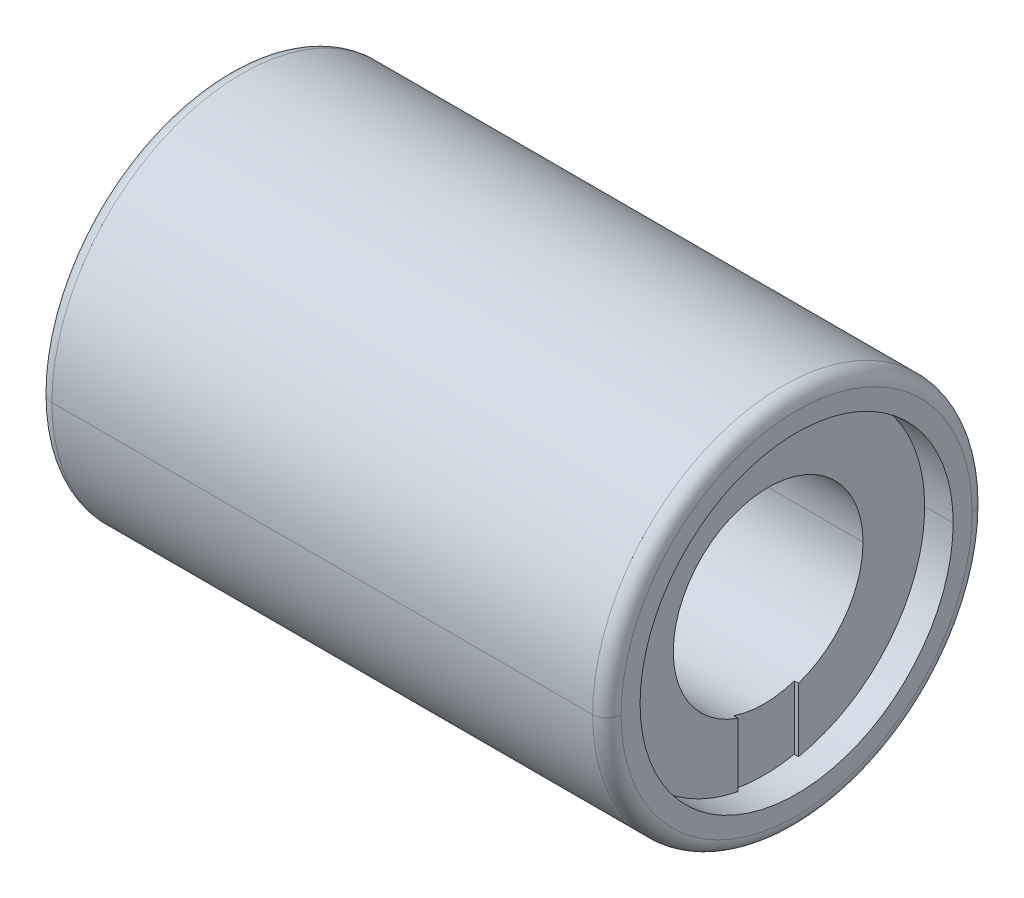
ISO-10303-21;
HEADER;
FILE_DESCRIPTION(('STEP AP214'),'2;1');
FILE_NAME('part.step','',(''),(''),'','','');
FILE_SCHEMA(('AUTOMOTIVE_DESIGN { 1 0 10303 214 1 1 1 1 }'));
ENDSEC;
DATA;
#1=APPLICATION_CONTEXT('core data for automotive mechanical design processes');
#2=APPLICATION_PROTOCOL_DEFINITION('international standard','automotive_design',2000,#1);
#3=PRODUCT_CONTEXT('',#1,'mechanical');
#4=PRODUCT('Part','Part','',(#3));
#5=PRODUCT_RELATED_PRODUCT_CATEGORY('part','',(#4));
#6=PRODUCT_DEFINITION_FORMATION('','',#4);
#7=PRODUCT_DEFINITION_CONTEXT('part definition',#1,'design');
#8=PRODUCT_DEFINITION('design','',#6,#7);
#9=PRODUCT_DEFINITION_SHAPE('','',#8);
#10=(LENGTH_UNIT() NAMED_UNIT(*) SI_UNIT(.MILLI.,.METRE.));
#11=(NAMED_UNIT(*) PLANE_ANGLE_UNIT() SI_UNIT($,.RADIAN.));
#12=(NAMED_UNIT(*) SI_UNIT($,.STERADIAN.) SOLID_ANGLE_UNIT());
#13=UNCERTAINTY_MEASURE_WITH_UNIT(LENGTH_MEASURE(1.E-05),#10,'distance_accuracy_value','');
#14=(GEOMETRIC_REPRESENTATION_CONTEXT(3) GLOBAL_UNCERTAINTY_ASSIGNED_CONTEXT((#13)) GLOBAL_UNIT_ASSIGNED_CONTEXT((#10,
#11,#12)) REPRESENTATION_CONTEXT('',''));
#15=CARTESIAN_POINT('',(0.,0.,0.));
#16=DIRECTION('',(0.,0.,1.));
#17=DIRECTION('',(1.,0.,0.));
#18=AXIS2_PLACEMENT_3D('',#15,#16,#17);
#19=CARTESIAN_POINT('',(12.,0.,0.));
#20=DIRECTION('',(-1.,0.,0.));
#21=DIRECTION('',(0.,-1.,0.));
#22=AXIS2_PLACEMENT_3D('',#19,#20,#21);
#23=CYLINDRICAL_SURFACE('',#22,3.3);
#24=CARTESIAN_POINT('',(0.6,0.,0.));
#25=DIRECTION('',(1.,0.,0.));
#26=DIRECTION('',(0.,0.,-1.));
#27=AXIS2_PLACEMENT_3D('',#24,#25,#26);
#28=CIRCLE('',#27,3.3);
#29=CARTESIAN_POINT('',(0.6,0.,-3.3));
#30=VERTEX_POINT('',#29);
#31=CARTESIAN_POINT('',(0.6,0.,3.3));
#32=VERTEX_POINT('',#31);
#33=EDGE_CURVE('E11',#30,#32,#28,.T.);
#34=ORIENTED_EDGE('',*,*,#33,.T.);
#35=DIRECTION('',(-1.,0.,0.));
#36=VECTOR('',#35,1.);
#37=CARTESIAN_POINT('',(0.6,0.,3.3));
#38=LINE('',#37,#36);
#39=CARTESIAN_POINT('',(0.,0.,3.3));
#40=VERTEX_POINT('',#39);
#41=EDGE_CURVE('E26',#32,#40,#38,.T.);
#42=ORIENTED_EDGE('',*,*,#41,.T.);
#43=CARTESIAN_POINT('',(0.,0.,0.));
#44=DIRECTION('',(1.,0.,0.));
#45=DIRECTION('',(0.,0.,-1.));
#46=AXIS2_PLACEMENT_3D('',#43,#44,#45);
#47=CIRCLE('',#46,3.3);
#48=CARTESIAN_POINT('',(0.,0.,-3.3));
#49=VERTEX_POINT('',#48);
#50=EDGE_CURVE('E531',#49,#40,#47,.T.);
#51=ORIENTED_EDGE('',*,*,#50,.F.);
#52=DIRECTION('',(-1.,0.,0.));
#53=VECTOR('',#52,1.);
#54=CARTESIAN_POINT('',(0.6,0.,-3.3));
#55=LINE('',#54,#53);
#56=EDGE_CURVE('E528',#30,#49,#55,.T.);
#57=ORIENTED_EDGE('',*,*,#56,.F.);
#58=EDGE_LOOP('',(#34,#42,#51,#57));
#59=FACE_BOUND('',#58,.T.);
#60=ADVANCED_FACE('F18',(#59),#23,.F.);
#61=CARTESIAN_POINT('',(12.,0.,0.));
#62=DIRECTION('',(-1.,0.,0.));
#63=DIRECTION('',(0.,1.,0.));
#64=AXIS2_PLACEMENT_3D('',#61,#62,#63);
#65=CYLINDRICAL_SURFACE('',#64,3.3);
#66=CARTESIAN_POINT('',(0.,0.,0.));
#67=DIRECTION('',(1.,0.,0.));
#68=DIRECTION('',(0.,0.,-1.));
#69=AXIS2_PLACEMENT_3D('',#66,#67,#68);
#70=CIRCLE('',#69,3.3);
#71=EDGE_CURVE('E466',#40,#49,#70,.T.);
#72=ORIENTED_EDGE('',*,*,#71,.F.);
#73=ORIENTED_EDGE('',*,*,#41,.F.);
#74=CARTESIAN_POINT('',(0.6,0.,0.));
#75=DIRECTION('',(1.,0.,0.));
#76=DIRECTION('',(0.,0.,-1.));
#77=AXIS2_PLACEMENT_3D('',#74,#75,#76);
#78=CIRCLE('',#77,3.3);
#79=EDGE_CURVE('E460',#32,#30,#78,.T.);
#80=ORIENTED_EDGE('',*,*,#79,.T.);
#81=ORIENTED_EDGE('',*,*,#56,.T.);
#82=EDGE_LOOP('',(#72,#73,#80,#81));
#83=FACE_BOUND('',#82,.T.);
#84=ADVANCED_FACE('F316',(#83),#65,.F.);
#85=CARTESIAN_POINT('',(0.6,3.3,0.));
#86=DIRECTION('',(-1.,0.,0.));
#87=DIRECTION('',(0.,0.,1.));
#88=AXIS2_PLACEMENT_3D('',#85,#86,#87);
#89=PLANE('',#88);
#90=CARTESIAN_POINT('',(0.6,0.,0.));
#91=DIRECTION('',(1.,0.,0.));
#92=DIRECTION('',(0.,0.,-1.));
#93=AXIS2_PLACEMENT_3D('',#90,#91,#92);
#94=CIRCLE('',#93,2.);
#95=CARTESIAN_POINT('',(0.6,0.,-2.));
#96=VERTEX_POINT('',#95);
#97=CARTESIAN_POINT('',(0.6,0.,2.));
#98=VERTEX_POINT('',#97);
#99=EDGE_CURVE('E458',#96,#98,#94,.T.);
#100=ORIENTED_EDGE('',*,*,#99,.T.);
#101=CARTESIAN_POINT('',(0.6,0.,0.));
#102=DIRECTION('',(1.,0.,0.));
#103=DIRECTION('',(0.,0.,-1.));
#104=AXIS2_PLACEMENT_3D('',#101,#102,#103);
#105=CIRCLE('',#104,2.);
#106=EDGE_CURVE('E457',#98,#96,#105,.T.);
#107=ORIENTED_EDGE('',*,*,#106,.T.);
#108=EDGE_LOOP('',(#100,#107));
#109=FACE_BOUND('',#108,.T.);
#110=ORIENTED_EDGE('',*,*,#33,.F.);
#111=ORIENTED_EDGE('',*,*,#79,.F.);
#112=EDGE_LOOP('',(#110,#111));
#113=FACE_BOUND('',#112,.T.);
#114=ADVANCED_FACE('F320',(#109,#113),#89,.T.);
#115=CARTESIAN_POINT('',(12.,0.,0.));
#116=DIRECTION('',(-1.,0.,0.));
#117=DIRECTION('',(0.,1.,0.));
#118=AXIS2_PLACEMENT_3D('',#115,#116,#117);
#119=CYLINDRICAL_SURFACE('',#118,2.);
#120=ORIENTED_EDGE('',*,*,#106,.F.);
#121=DIRECTION('',(-1.,0.,0.));
#122=VECTOR('',#121,1.);
#123=CARTESIAN_POINT('',(11.4,0.,2.));
#124=LINE('',#123,#122);
#125=CARTESIAN_POINT('',(11.4,0.,2.));
#126=VERTEX_POINT('',#125);
#127=EDGE_CURVE('E424',#126,#98,#124,.T.);
#128=ORIENTED_EDGE('',*,*,#127,.F.);
#129=CARTESIAN_POINT('',(11.4,0.,0.));
#130=DIRECTION('',(1.,0.,0.));
#131=DIRECTION('',(0.,0.,-1.));
#132=AXIS2_PLACEMENT_3D('',#129,#130,#131);
#133=CIRCLE('',#132,2.);
#134=CARTESIAN_POINT('',(11.4,-1.89483508517232,0.64));
#135=VERTEX_POINT('',#134);
#136=EDGE_CURVE('E421',#126,#135,#133,.T.);
#137=ORIENTED_EDGE('',*,*,#136,.T.);
#138=DIRECTION('',(1.,0.,0.));
#139=VECTOR('',#138,1.);
#140=CARTESIAN_POINT('',(12.,-1.89483508517232,0.64));
#141=LINE('',#140,#139);
#142=CARTESIAN_POINT('',(11.312,-1.89483508517232,0.64));
#143=VERTEX_POINT('',#142);
#144=EDGE_CURVE('E419',#143,#135,#141,.T.);
#145=ORIENTED_EDGE('',*,*,#144,.F.);
#146=CARTESIAN_POINT('',(11.312,0.,0.));
#147=DIRECTION('',(1.,0.,0.));
#148=DIRECTION('',(0.,0.,-1.));
#149=AXIS2_PLACEMENT_3D('',#146,#147,#148);
#150=CIRCLE('',#149,2.);
#151=CARTESIAN_POINT('',(11.312,-1.89483508517232,-0.64));
#152=VERTEX_POINT('',#151);
#153=EDGE_CURVE('E433',#143,#152,#150,.T.);
#154=ORIENTED_EDGE('',*,*,#153,.T.);
#155=DIRECTION('',(1.,0.,0.));
#156=VECTOR('',#155,1.);
#157=CARTESIAN_POINT('',(12.,-1.89483508517232,-0.64));
#158=LINE('',#157,#156);
#159=CARTESIAN_POINT('',(11.4,-1.89483508517232,-0.64));
#160=VERTEX_POINT('',#159);
#161=EDGE_CURVE('E435',#152,#160,#158,.T.);
#162=ORIENTED_EDGE('',*,*,#161,.T.);
#163=CARTESIAN_POINT('',(11.4,0.,0.));
#164=DIRECTION('',(1.,0.,0.));
#165=DIRECTION('',(0.,0.,-1.));
#166=AXIS2_PLACEMENT_3D('',#163,#164,#165);
#167=CIRCLE('',#166,2.);
#168=CARTESIAN_POINT('',(11.4,0.,-2.));
#169=VERTEX_POINT('',#168);
#170=EDGE_CURVE('E439',#160,#169,#167,.T.);
#171=ORIENTED_EDGE('',*,*,#170,.T.);
#172=DIRECTION('',(-1.,0.,0.));
#173=VECTOR('',#172,1.);
#174=CARTESIAN_POINT('',(11.4,0.,-2.));
#175=LINE('',#174,#173);
#176=EDGE_CURVE('E444',#169,#96,#175,.T.);
#177=ORIENTED_EDGE('',*,*,#176,.T.);
#178=EDGE_LOOP('',(#120,#128,#137,#145,#154,#162,#171,#177));
#179=FACE_BOUND('',#178,.T.);
#180=ADVANCED_FACE('F325',(#179),#119,.F.);
#181=CARTESIAN_POINT('',(12.,0.,0.));
#182=DIRECTION('',(-1.,0.,0.));
#183=DIRECTION('',(0.,-1.,0.));
#184=AXIS2_PLACEMENT_3D('',#181,#182,#183);
#185=CYLINDRICAL_SURFACE('',#184,2.);
#186=CARTESIAN_POINT('',(11.4,0.,0.));
#187=DIRECTION('',(1.,0.,0.));
#188=DIRECTION('',(0.,0.,-1.));
#189=AXIS2_PLACEMENT_3D('',#186,#187,#188);
#190=CIRCLE('',#189,2.);
#191=EDGE_CURVE('E407',#169,#126,#190,.T.);
#192=ORIENTED_EDGE('',*,*,#191,.T.);
#193=ORIENTED_EDGE('',*,*,#127,.T.);
#194=ORIENTED_EDGE('',*,*,#99,.F.);
#195=ORIENTED_EDGE('',*,*,#176,.F.);
#196=EDGE_LOOP('',(#192,#193,#194,#195));
#197=FACE_BOUND('',#196,.T.);
#198=ADVANCED_FACE('F331',(#197),#185,.F.);
#199=CARTESIAN_POINT('',(11.4,2.,0.));
#200=DIRECTION('',(1.,0.,0.));
#201=DIRECTION('',(0.,0.,-1.));
#202=AXIS2_PLACEMENT_3D('',#199,#200,#201);
#203=PLANE('',#202);
#204=DIRECTION('',(0.,-1.,0.));
#205=VECTOR('',#204,1.);
#206=CARTESIAN_POINT('',(11.4,2.,0.64));
#207=LINE('',#206,#205);
#208=CARTESIAN_POINT('',(11.4,-3.2373445908646,0.64));
#209=VERTEX_POINT('',#208);
#210=EDGE_CURVE('E402',#135,#209,#207,.T.);
#211=ORIENTED_EDGE('',*,*,#210,.F.);
#212=ORIENTED_EDGE('',*,*,#136,.F.);
#213=ORIENTED_EDGE('',*,*,#191,.F.);
#214=ORIENTED_EDGE('',*,*,#170,.F.);
#215=DIRECTION('',(0.,1.,0.));
#216=VECTOR('',#215,1.);
#217=CARTESIAN_POINT('',(11.4,2.,-0.64));
#218=LINE('',#217,#216);
#219=CARTESIAN_POINT('',(11.4,-3.2373445908646,-0.639999999999998));
#220=VERTEX_POINT('',#219);
#221=EDGE_CURVE('E398',#220,#160,#218,.T.);
#222=ORIENTED_EDGE('',*,*,#221,.F.);
#223=CARTESIAN_POINT('',(11.4,0.,0.));
#224=DIRECTION('',(1.,0.,0.));
#225=DIRECTION('',(0.,0.,-1.));
#226=AXIS2_PLACEMENT_3D('',#223,#224,#225);
#227=CIRCLE('',#226,3.3);
#228=CARTESIAN_POINT('',(11.4,0.,-3.3));
#229=VERTEX_POINT('',#228);
#230=EDGE_CURVE('E397',#220,#229,#227,.T.);
#231=ORIENTED_EDGE('',*,*,#230,.T.);
#232=CARTESIAN_POINT('',(11.4,0.,0.));
#233=DIRECTION('',(1.,0.,0.));
#234=DIRECTION('',(0.,0.,-1.));
#235=AXIS2_PLACEMENT_3D('',#232,#233,#234);
#236=CIRCLE('',#235,3.3);
#237=CARTESIAN_POINT('',(11.4,0.,3.3));
#238=VERTEX_POINT('',#237);
#239=EDGE_CURVE('E477',#229,#238,#236,.T.);
#240=ORIENTED_EDGE('',*,*,#239,.T.);
#241=CARTESIAN_POINT('',(11.4,0.,0.));
#242=DIRECTION('',(1.,0.,0.));
#243=DIRECTION('',(0.,0.,-1.));
#244=AXIS2_PLACEMENT_3D('',#241,#242,#243);
#245=CIRCLE('',#244,3.3);
#246=EDGE_CURVE('E375',#238,#209,#245,.T.);
#247=ORIENTED_EDGE('',*,*,#246,.T.);
#248=EDGE_LOOP('',(#211,#212,#213,#214,#222,#231,#240,#247));
#249=FACE_BOUND('',#248,.T.);
#250=ADVANCED_FACE('F335',(#249),#203,.T.);
#251=CARTESIAN_POINT('',(12.,0.,0.));
#252=DIRECTION('',(-1.,0.,0.));
#253=DIRECTION('',(0.,1.,0.));
#254=AXIS2_PLACEMENT_3D('',#251,#252,#253);
#255=CYLINDRICAL_SURFACE('',#254,3.3);
#256=ORIENTED_EDGE('',*,*,#246,.F.);
#257=DIRECTION('',(-1.,0.,0.));
#258=VECTOR('',#257,1.);
#259=CARTESIAN_POINT('',(12.,0.,3.3));
#260=LINE('',#259,#258);
#261=CARTESIAN_POINT('',(12.,0.,3.3));
#262=VERTEX_POINT('',#261);
#263=EDGE_CURVE('E368',#262,#238,#260,.T.);
#264=ORIENTED_EDGE('',*,*,#263,.F.);
#265=CARTESIAN_POINT('',(12.,0.,0.));
#266=DIRECTION('',(1.,0.,0.));
#267=DIRECTION('',(0.,0.,-1.));
#268=AXIS2_PLACEMENT_3D('',#265,#266,#267);
#269=CIRCLE('',#268,3.3);
#270=CARTESIAN_POINT('',(12.,0.,-3.3));
#271=VERTEX_POINT('',#270);
#272=EDGE_CURVE('E373',#262,#271,#269,.T.);
#273=ORIENTED_EDGE('',*,*,#272,.T.);
#274=DIRECTION('',(-1.,0.,0.));
#275=VECTOR('',#274,1.);
#276=CARTESIAN_POINT('',(12.,0.,-3.3));
#277=LINE('',#276,#275);
#278=EDGE_CURVE('E370',#271,#229,#277,.T.);
#279=ORIENTED_EDGE('',*,*,#278,.T.);
#280=ORIENTED_EDGE('',*,*,#230,.F.);
#281=DIRECTION('',(1.,0.,0.));
#282=VECTOR('',#281,1.);
#283=CARTESIAN_POINT('',(11.312,-3.2373445908646,-0.639999999999998));
#284=LINE('',#283,#282);
#285=CARTESIAN_POINT('',(11.312,-3.2373445908646,-0.639999999999998));
#286=VERTEX_POINT('',#285);
#287=EDGE_CURVE('E377',#286,#220,#284,.T.);
#288=ORIENTED_EDGE('',*,*,#287,.F.);
#289=CARTESIAN_POINT('',(11.312,0.,0.));
#290=DIRECTION('',(1.,0.,0.));
#291=DIRECTION('',(0.,0.,-1.));
#292=AXIS2_PLACEMENT_3D('',#289,#290,#291);
#293=CIRCLE('',#292,3.3);
#294=CARTESIAN_POINT('',(11.312,-3.2373445908646,0.64));
#295=VERTEX_POINT('',#294);
#296=EDGE_CURVE('E489',#295,#286,#293,.T.);
#297=ORIENTED_EDGE('',*,*,#296,.F.);
#298=DIRECTION('',(1.,0.,0.));
#299=VECTOR('',#298,1.);
#300=CARTESIAN_POINT('',(11.312,-3.2373445908646,0.64));
#301=LINE('',#300,#299);
#302=EDGE_CURVE('E487',#295,#209,#301,.T.);
#303=ORIENTED_EDGE('',*,*,#302,.T.);
#304=EDGE_LOOP('',(#256,#264,#273,#279,#280,#288,#297,#303));
#305=FACE_BOUND('',#304,.T.);
#306=ADVANCED_FACE('F339',(#305),#255,.F.);
#307=CARTESIAN_POINT('',(11.312,-1.8525657883055,0.64));
#308=DIRECTION('',(0.,0.,1.));
#309=DIRECTION('',(1.,0.,0.));
#310=AXIS2_PLACEMENT_3D('',#307,#308,#309);
#311=PLANE('',#310);
#312=ORIENTED_EDGE('',*,*,#144,.T.);
#313=ORIENTED_EDGE('',*,*,#210,.T.);
#314=ORIENTED_EDGE('',*,*,#302,.F.);
#315=DIRECTION('',(0.,-1.,0.));
#316=VECTOR('',#315,1.);
#317=CARTESIAN_POINT('',(11.312,-1.8525657883055,0.64));
#318=LINE('',#317,#316);
#319=EDGE_CURVE('E492',#143,#295,#318,.T.);
#320=ORIENTED_EDGE('',*,*,#319,.F.);
#321=EDGE_LOOP('',(#312,#313,#314,#320));
#322=FACE_BOUND('',#321,.T.);
#323=ADVANCED_FACE('F343',(#322),#311,.F.);
#324=CARTESIAN_POINT('',(11.312,0.,0.));
#325=DIRECTION('',(1.,0.,0.));
#326=DIRECTION('',(0.,0.,-1.));
#327=AXIS2_PLACEMENT_3D('',#324,#325,#326);
#328=PLANE('',#327);
#329=ORIENTED_EDGE('',*,*,#319,.T.);
#330=ORIENTED_EDGE('',*,*,#296,.T.);
#331=DIRECTION('',(0.,1.,0.));
#332=VECTOR('',#331,1.);
#333=CARTESIAN_POINT('',(11.312,-3.2373445908646,-0.64));
#334=LINE('',#333,#332);
#335=EDGE_CURVE('E372',#286,#152,#334,.T.);
#336=ORIENTED_EDGE('',*,*,#335,.T.);
#337=ORIENTED_EDGE('',*,*,#153,.F.);
#338=EDGE_LOOP('',(#329,#330,#336,#337));
#339=FACE_BOUND('',#338,.T.);
#340=ADVANCED_FACE('F347',(#339),#328,.T.);
#341=CARTESIAN_POINT('',(11.312,-3.2373445908646,-0.64));
#342=DIRECTION('',(0.,0.,-1.));
#343=DIRECTION('',(-1.,0.,0.));
#344=AXIS2_PLACEMENT_3D('',#341,#342,#343);
#345=PLANE('',#344);
#346=ORIENTED_EDGE('',*,*,#161,.F.);
#347=ORIENTED_EDGE('',*,*,#335,.F.);
#348=ORIENTED_EDGE('',*,*,#287,.T.);
#349=ORIENTED_EDGE('',*,*,#221,.T.);
#350=EDGE_LOOP('',(#346,#347,#348,#349));
#351=FACE_BOUND('',#350,.T.);
#352=ADVANCED_FACE('F351',(#351),#345,.F.);
#353=CARTESIAN_POINT('',(12.,0.,0.));
#354=DIRECTION('',(-1.,0.,0.));
#355=DIRECTION('',(0.,-1.,0.));
#356=AXIS2_PLACEMENT_3D('',#353,#354,#355);
#357=CYLINDRICAL_SURFACE('',#356,3.3);
#358=CARTESIAN_POINT('',(12.,0.,0.));
#359=DIRECTION('',(1.,0.,0.));
#360=DIRECTION('',(0.,0.,-1.));
#361=AXIS2_PLACEMENT_3D('',#358,#359,#360);
#362=CIRCLE('',#361,3.3);
#363=EDGE_CURVE('E257',#271,#262,#362,.T.);
#364=ORIENTED_EDGE('',*,*,#363,.T.);
#365=ORIENTED_EDGE('',*,*,#263,.T.);
#366=ORIENTED_EDGE('',*,*,#239,.F.);
#367=ORIENTED_EDGE('',*,*,#278,.F.);
#368=EDGE_LOOP('',(#364,#365,#366,#367));
#369=FACE_BOUND('',#368,.T.);
#370=ADVANCED_FACE('F354',(#369),#357,.F.);
#371=CARTESIAN_POINT('',(12.,3.3,0.));
#372=DIRECTION('',(1.,0.,0.));
#373=DIRECTION('',(0.,0.,-1.));
#374=AXIS2_PLACEMENT_3D('',#371,#372,#373);
#375=PLANE('',#374);
#376=CARTESIAN_POINT('',(12.,0.,0.));
#377=DIRECTION('',(1.,0.,0.));
#378=DIRECTION('',(0.,0.,-1.));
#379=AXIS2_PLACEMENT_3D('',#376,#377,#378);
#380=CIRCLE('',#379,3.7);
#381=CARTESIAN_POINT('',(12.,0.,-3.7));
#382=VERTEX_POINT('',#381);
#383=CARTESIAN_POINT('',(12.0000000000001,0.,3.7));
#384=VERTEX_POINT('',#383);
#385=EDGE_CURVE('E249',#382,#384,#380,.T.);
#386=ORIENTED_EDGE('',*,*,#385,.T.);
#387=CARTESIAN_POINT('',(12.,0.,0.));
#388=DIRECTION('',(1.,0.,0.));
#389=DIRECTION('',(0.,0.,-1.));
#390=AXIS2_PLACEMENT_3D('',#387,#388,#389);
#391=CIRCLE('',#390,3.7);
#392=EDGE_CURVE('E239',#384,#382,#391,.T.);
#393=ORIENTED_EDGE('',*,*,#392,.T.);
#394=EDGE_LOOP('',(#386,#393));
#395=FACE_BOUND('',#394,.T.);
#396=ORIENTED_EDGE('',*,*,#363,.F.);
#397=ORIENTED_EDGE('',*,*,#272,.F.);
#398=EDGE_LOOP('',(#396,#397));
#399=FACE_BOUND('',#398,.T.);
#400=ADVANCED_FACE('F216',(#395,#399),#375,.T.);
#401=CARTESIAN_POINT('',(11.7000000000001,0.,0.));
#402=DIRECTION('',(1.,0.,0.));
#403=DIRECTION('',(0.,1.,0.));
#404=AXIS2_PLACEMENT_3D('',#401,#402,#403);
#405=TOROIDAL_SURFACE('',#404,3.7,0.3);
#406=CARTESIAN_POINT('',(11.7,0.,0.));
#407=DIRECTION('',(1.,0.,0.));
#408=DIRECTION('',(0.,0.,-1.));
#409=AXIS2_PLACEMENT_3D('',#406,#407,#408);
#410=CIRCLE('',#409,4.);
#411=CARTESIAN_POINT('',(11.7000000000001,0.,4.));
#412=VERTEX_POINT('',#411);
#413=CARTESIAN_POINT('',(11.7,0.,-4.));
#414=VERTEX_POINT('',#413);
#415=EDGE_CURVE('E238',#412,#414,#410,.T.);
#416=ORIENTED_EDGE('',*,*,#415,.T.);
#417=CARTESIAN_POINT('',(11.7000000000001,0.,-4.));
#418=CARTESIAN_POINT('',(11.7049087434784,0.,-4.00000010412663));
#419=CARTESIAN_POINT('',(11.7098174780965,0.,-3.99987952513755));
#420=CARTESIAN_POINT('',(11.7196231265002,0.,-3.99939774858556));
#421=CARTESIAN_POINT('',(11.7245200402858,0.,-3.99903655102266));
#422=CARTESIAN_POINT('',(11.7342902439122,0.,-3.99807428498066));
#423=CARTESIAN_POINT('',(11.739163533753,0.,-3.99747321650157));
#424=CARTESIAN_POINT('',(11.7488747509204,0.,-3.9960326894773));
#425=CARTESIAN_POINT('',(11.7537126782469,0.,-3.99519323093212));
#426=CARTESIAN_POINT('',(11.7633415149629,0.,-3.99327793730982));
#427=CARTESIAN_POINT('',(11.7681324243524,0.,-3.99220210223269));
#428=CARTESIAN_POINT('',(11.7776556835897,0.,-3.98981664968404));
#429=CARTESIAN_POINT('',(11.7823880334376,0.,-3.98850703221251));
#430=CARTESIAN_POINT('',(11.7917827729153,0.,-3.98565716922681));
#431=CARTESIAN_POINT('',(11.7964451625452,0.,-3.98411692371264));
#432=CARTESIAN_POINT('',(11.8056887494903,0.,-3.98080951539718));
#433=CARTESIAN_POINT('',(11.8102699468056,0.,-3.9790423525959));
#434=CARTESIAN_POINT('',(11.8193401126137,0.,-3.97528536691087));
#435=CARTESIAN_POINT('',(11.8238290811065,0.,-3.97329554402713));
#436=CARTESIAN_POINT('',(11.8327039749519,0.,-3.96909803184694));
#437=CARTESIAN_POINT('',(11.8370899003046,0.,-3.96689034255049));
#438=CARTESIAN_POINT('',(11.8457481417912,0.,-3.96226241605852));
#439=CARTESIAN_POINT('',(11.8500204579252,0.,-3.959842178863));
#440=CARTESIAN_POINT('',(11.8584411885909,0.,-3.95479498713716));
#441=CARTESIAN_POINT('',(11.8625896031225,0.,-3.95216803260683));
#442=CARTESIAN_POINT('',(11.8707525366894,0.,-3.9467137347747));
#443=CARTESIAN_POINT('',(11.8747670557247,0.,-3.94388639147289));
#444=CARTESIAN_POINT('',(11.8826525269709,0.,-3.9380381274155));
#445=CARTESIAN_POINT('',(11.8865234791819,0.,-3.93501720665993));
#446=CARTESIAN_POINT('',(11.8941124913165,0.,-3.92878906535771));
#447=CARTESIAN_POINT('',(11.8978305512402,0.,-3.92558184481106));
#448=CARTESIAN_POINT('',(11.9051048216682,0.,-3.91898883040191));
#449=CARTESIAN_POINT('',(11.9086610321726,0.,-3.91560303653941));
#450=CARTESIAN_POINT('',(11.9156030365395,0.,-3.90866103217252));
#451=CARTESIAN_POINT('',(11.918988830402,0.,-3.90510482166814));
#452=CARTESIAN_POINT('',(11.9255818448112,0.,-3.89783055124008));
#453=CARTESIAN_POINT('',(11.9287890653578,0.,-3.8941124913164));
#454=CARTESIAN_POINT('',(11.93501720666,0.,-3.88652347918179));
#455=CARTESIAN_POINT('',(11.9380381274156,0.,-3.88265252697084));
#456=CARTESIAN_POINT('',(11.943886391473,0.,-3.87476705572462));
#457=CARTESIAN_POINT('',(11.9467137347748,0.,-3.87075253668934));
#458=CARTESIAN_POINT('',(11.9521680326069,0.,-3.86258960312242));
#459=CARTESIAN_POINT('',(11.9547949871373,0.,-3.85844118859079));
#460=CARTESIAN_POINT('',(11.9598421788631,0.,-3.85002045792514));
#461=CARTESIAN_POINT('',(11.9622624160586,0.,-3.84574814179113));
#462=CARTESIAN_POINT('',(11.9668903425506,0.,-3.83708990030447));
#463=CARTESIAN_POINT('',(11.969098031847,0.,-3.83270397495181));
#464=CARTESIAN_POINT('',(11.9732955440272,0.,-3.82382908110636));
#465=CARTESIAN_POINT('',(11.975285366911,0.,-3.81934011261356));
#466=CARTESIAN_POINT('',(11.979042352596,0.,-3.8102699468055));
#467=CARTESIAN_POINT('',(11.9808095153973,0.,-3.80568874949024));
#468=CARTESIAN_POINT('',(11.9841169237127,0.,-3.79644516254509));
#469=CARTESIAN_POINT('',(11.9856571692269,0.,-3.7917827729152));
#470=CARTESIAN_POINT('',(11.9885070322126,0.,-3.78238803343748));
#471=CARTESIAN_POINT('',(11.9898166496841,0.,-3.77765568358964));
#472=CARTESIAN_POINT('',(11.9922021022328,0.,-3.76813242435232));
#473=CARTESIAN_POINT('',(11.9932779373099,0.,-3.76334151496285));
#474=CARTESIAN_POINT('',(11.9951932309322,0.,-3.75371267824683));
#475=CARTESIAN_POINT('',(11.9960326894774,0.,-3.7488747509203));
#476=CARTESIAN_POINT('',(11.9974732165017,0.,-3.73916353375292));
#477=CARTESIAN_POINT('',(11.9980742849808,0.,-3.73429024391208));
#478=CARTESIAN_POINT('',(11.9990365510228,0.,-3.72452004028566));
#479=CARTESIAN_POINT('',(11.9993977485857,0.,-3.71962312650007));
#480=CARTESIAN_POINT('',(11.9998795251376,0.,-3.70981747809638));
#481=CARTESIAN_POINT('',(12.0000001041267,0.,-3.70490874347827));
#482=CARTESIAN_POINT('',(12.0000000000001,0.,-3.7));
#483=B_SPLINE_CURVE_WITH_KNOTS('',3,(#417,#418,#419,#420,#421,#422,#423,#424,#425,#426,#427,
#428,#429,#430,#431,#432,#433,#434,#435,#436,#437,#438,#439,#440,#441,#442,#443,#444,#445,#446,
#447,#448,#449,#450,#451,#452,#453,#454,#455,#456,#457,#458,#459,#460,#461,#462,#463,#464,#465,
#466,#467,#468,#469,#470,#471,#472,#473,#474,#475,#476,#477,#478,#479,#480,#481,#482),
.UNSPECIFIED.,.F.,.F.,(4,2,2,2,2,2,2,2,2,2,2,2,2,2,2,2,2,2,2,2,2,2,2,2,2,2,2,2,2,2,2,2,4),(0.,
0.0147247371137477,0.0294494742274954,0.0441742113412424,0.058898948454989,0.0736236855687368,
0.088348422682484,0.103073159796232,0.117797896909979,0.132522634023726,0.147247371137473,
0.161972108251222,0.176696845364968,0.191421582478716,0.206146319592463,0.220871056706211,
0.235595793819958,0.250320530933705,0.265045268047452,0.279770005161199,0.294494742274947,
0.309219479388694,0.323944216502442,0.338668953616189,0.353393690729936,0.368118427843684,
0.382843164957431,0.397567902071179,0.412292639184926,0.427017376298674,0.44174211341242,
0.456466850526168,0.471191587639915),.UNSPECIFIED.);
#484=EDGE_CURVE('E241',#414,#382,#483,.T.);
#485=ORIENTED_EDGE('',*,*,#484,.T.);
#486=ORIENTED_EDGE('',*,*,#392,.F.);
#487=CARTESIAN_POINT('',(11.7000000000001,0.,4.));
#488=CARTESIAN_POINT('',(11.7049087434784,0.,4.00000010412663));
#489=CARTESIAN_POINT('',(11.7098174780965,0.,3.99987952513755));
#490=CARTESIAN_POINT('',(11.7196231265002,0.,3.99939774858556));
#491=CARTESIAN_POINT('',(11.7245200402858,0.,3.99903655102266));
#492=CARTESIAN_POINT('',(11.7342902439122,0.,3.99807428498066));
#493=CARTESIAN_POINT('',(11.739163533753,0.,3.99747321650157));
#494=CARTESIAN_POINT('',(11.7488747509204,0.,3.9960326894773));
#495=CARTESIAN_POINT('',(11.7537126782469,0.,3.99519323093212));
#496=CARTESIAN_POINT('',(11.7633415149629,0.,3.99327793730982));
#497=CARTESIAN_POINT('',(11.7681324243524,0.,3.99220210223269));
#498=CARTESIAN_POINT('',(11.7776556835897,0.,3.98981664968404));
#499=CARTESIAN_POINT('',(11.7823880334376,0.,3.98850703221251));
#500=CARTESIAN_POINT('',(11.7917827729153,0.,3.98565716922681));
#501=CARTESIAN_POINT('',(11.7964451625452,0.,3.98411692371264));
#502=CARTESIAN_POINT('',(11.8056887494903,0.,3.98080951539718));
#503=CARTESIAN_POINT('',(11.8102699468056,0.,3.9790423525959));
#504=CARTESIAN_POINT('',(11.8193401126137,0.,3.97528536691087));
#505=CARTESIAN_POINT('',(11.8238290811065,0.,3.97329554402713));
#506=CARTESIAN_POINT('',(11.8327039749519,0.,3.96909803184694));
#507=CARTESIAN_POINT('',(11.8370899003046,0.,3.96689034255049));
#508=CARTESIAN_POINT('',(11.8457481417912,0.,3.96226241605852));
#509=CARTESIAN_POINT('',(11.8500204579252,0.,3.959842178863));
#510=CARTESIAN_POINT('',(11.8584411885909,0.,3.95479498713716));
#511=CARTESIAN_POINT('',(11.8625896031225,0.,3.95216803260683));
#512=CARTESIAN_POINT('',(11.8707525366894,0.,3.9467137347747));
#513=CARTESIAN_POINT('',(11.8747670557247,0.,3.94388639147289));
#514=CARTESIAN_POINT('',(11.8826525269709,0.,3.9380381274155));
#515=CARTESIAN_POINT('',(11.8865234791819,0.,3.93501720665993));
#516=CARTESIAN_POINT('',(11.8941124913165,0.,3.92878906535771));
#517=CARTESIAN_POINT('',(11.8978305512402,0.,3.92558184481106));
#518=CARTESIAN_POINT('',(11.9051048216682,0.,3.91898883040191));
#519=CARTESIAN_POINT('',(11.9086610321726,0.,3.91560303653941));
#520=CARTESIAN_POINT('',(11.9156030365395,0.,3.90866103217252));
#521=CARTESIAN_POINT('',(11.918988830402,0.,3.90510482166814));
#522=CARTESIAN_POINT('',(11.9255818448112,0.,3.89783055124008));
#523=CARTESIAN_POINT('',(11.9287890653578,0.,3.8941124913164));
#524=CARTESIAN_POINT('',(11.93501720666,0.,3.88652347918179));
#525=CARTESIAN_POINT('',(11.9380381274156,0.,3.88265252697084));
#526=CARTESIAN_POINT('',(11.943886391473,0.,3.87476705572462));
#527=CARTESIAN_POINT('',(11.9467137347748,0.,3.87075253668934));
#528=CARTESIAN_POINT('',(11.9521680326069,0.,3.86258960312242));
#529=CARTESIAN_POINT('',(11.9547949871373,0.,3.85844118859079));
#530=CARTESIAN_POINT('',(11.9598421788631,0.,3.85002045792514));
#531=CARTESIAN_POINT('',(11.9622624160586,0.,3.84574814179113));
#532=CARTESIAN_POINT('',(11.9668903425506,0.,3.83708990030447));
#533=CARTESIAN_POINT('',(11.969098031847,0.,3.83270397495181));
#534=CARTESIAN_POINT('',(11.9732955440272,0.,3.82382908110636));
#535=CARTESIAN_POINT('',(11.975285366911,0.,3.81934011261356));
#536=CARTESIAN_POINT('',(11.979042352596,0.,3.8102699468055));
#537=CARTESIAN_POINT('',(11.9808095153973,0.,3.80568874949024));
#538=CARTESIAN_POINT('',(11.9841169237127,0.,3.79644516254509));
#539=CARTESIAN_POINT('',(11.9856571692269,0.,3.7917827729152));
#540=CARTESIAN_POINT('',(11.9885070322126,0.,3.78238803343748));
#541=CARTESIAN_POINT('',(11.9898166496841,0.,3.77765568358964));
#542=CARTESIAN_POINT('',(11.9922021022328,0.,3.76813242435232));
#543=CARTESIAN_POINT('',(11.9932779373099,0.,3.76334151496285));
#544=CARTESIAN_POINT('',(11.9951932309322,0.,3.75371267824683));
#545=CARTESIAN_POINT('',(11.9960326894774,0.,3.7488747509203));
#546=CARTESIAN_POINT('',(11.9974732165017,0.,3.73916353375292));
#547=CARTESIAN_POINT('',(11.9980742849808,0.,3.73429024391208));
#548=CARTESIAN_POINT('',(11.9990365510228,0.,3.72452004028566));
#549=CARTESIAN_POINT('',(11.9993977485857,0.,3.71962312650007));
#550=CARTESIAN_POINT('',(11.9998795251376,0.,3.70981747809638));
#551=CARTESIAN_POINT('',(12.0000001041267,0.,3.70490874347827));
#552=CARTESIAN_POINT('',(12.0000000000001,0.,3.7));
#553=B_SPLINE_CURVE_WITH_KNOTS('',3,(#487,#488,#489,#490,#491,#492,#493,#494,#495,#496,#497,
#498,#499,#500,#501,#502,#503,#504,#505,#506,#507,#508,#509,#510,#511,#512,#513,#514,#515,#516,
#517,#518,#519,#520,#521,#522,#523,#524,#525,#526,#527,#528,#529,#530,#531,#532,#533,#534,#535,
#536,#537,#538,#539,#540,#541,#542,#543,#544,#545,#546,#547,#548,#549,#550,#551,#552),
.UNSPECIFIED.,.F.,.F.,(4,2,2,2,2,2,2,2,2,2,2,2,2,2,2,2,2,2,2,2,2,2,2,2,2,2,2,2,2,2,2,2,4),(0.,
0.0147247371137477,0.0294494742274954,0.0441742113412425,0.0588989484549889,0.0736236855687368,
0.0883484226824839,0.103073159796232,0.117797896909979,0.132522634023726,0.147247371137474,
0.161972108251221,0.176696845364968,0.191421582478715,0.206146319592463,0.220871056706211,
0.235595793819958,0.250320530933705,0.265045268047452,0.2797700051612,0.294494742274947,
0.309219479388695,0.323944216502442,0.338668953616189,0.353393690729937,0.368118427843684,
0.382843164957431,0.397567902071179,0.412292639184926,0.427017376298673,0.441742113412421,
0.456466850526168,0.471191587639915),.UNSPECIFIED.);
#554=EDGE_CURVE('E234',#412,#384,#553,.T.);
#555=ORIENTED_EDGE('',*,*,#554,.F.);
#556=EDGE_LOOP('',(#416,#485,#486,#555));
#557=FACE_BOUND('',#556,.T.);
#558=ADVANCED_FACE('F209',(#557),#405,.T.);
#559=CARTESIAN_POINT('',(11.7000000000001,0.,0.));
#560=DIRECTION('',(1.,0.,0.));
#561=DIRECTION('',(0.,-1.,0.));
#562=AXIS2_PLACEMENT_3D('',#559,#560,#561);
#563=TOROIDAL_SURFACE('',#562,3.7,0.3);
#564=ORIENTED_EDGE('',*,*,#385,.F.);
#565=ORIENTED_EDGE('',*,*,#484,.F.);
#566=CARTESIAN_POINT('',(11.7,0.,0.));
#567=DIRECTION('',(1.,0.,0.));
#568=DIRECTION('',(0.,0.,-1.));
#569=AXIS2_PLACEMENT_3D('',#566,#567,#568);
#570=CIRCLE('',#569,4.);
#571=EDGE_CURVE('E162',#414,#412,#570,.T.);
#572=ORIENTED_EDGE('',*,*,#571,.T.);
#573=ORIENTED_EDGE('',*,*,#554,.T.);
#574=EDGE_LOOP('',(#564,#565,#572,#573));
#575=FACE_BOUND('',#574,.T.);
#576=ADVANCED_FACE('F198',(#575),#563,.T.);
#577=CARTESIAN_POINT('',(12.,0.,0.));
#578=DIRECTION('',(-1.,0.,0.));
#579=DIRECTION('',(0.,-1.,0.));
#580=AXIS2_PLACEMENT_3D('',#577,#578,#579);
#581=CYLINDRICAL_SURFACE('',#580,4.);
#582=ORIENTED_EDGE('',*,*,#571,.F.);
#583=DIRECTION('',(-1.,0.,0.));
#584=VECTOR('',#583,1.);
#585=CARTESIAN_POINT('',(11.7,0.,-4.));
#586=LINE('',#585,#584);
#587=CARTESIAN_POINT('',(0.3,0.,-4.));
#588=VERTEX_POINT('',#587);
#589=EDGE_CURVE('E159',#414,#588,#586,.T.);
#590=ORIENTED_EDGE('',*,*,#589,.T.);
#591=CARTESIAN_POINT('',(0.3,0.,0.));
#592=DIRECTION('',(1.,0.,0.));
#593=DIRECTION('',(0.,0.,-1.));
#594=AXIS2_PLACEMENT_3D('',#591,#592,#593);
#595=CIRCLE('',#594,4.);
#596=CARTESIAN_POINT('',(0.300000000000001,0.,4.));
#597=VERTEX_POINT('',#596);
#598=EDGE_CURVE('E157',#588,#597,#595,.T.);
#599=ORIENTED_EDGE('',*,*,#598,.T.);
#600=DIRECTION('',(-1.,0.,0.));
#601=VECTOR('',#600,1.);
#602=CARTESIAN_POINT('',(11.7,0.,4.));
#603=LINE('',#602,#601);
#604=EDGE_CURVE('E138',#412,#597,#603,.T.);
#605=ORIENTED_EDGE('',*,*,#604,.F.);
#606=EDGE_LOOP('',(#582,#590,#599,#605));
#607=FACE_BOUND('',#606,.T.);
#608=ADVANCED_FACE('F208',(#607),#581,.T.);
#609=CARTESIAN_POINT('',(12.,0.,0.));
#610=DIRECTION('',(-1.,0.,0.));
#611=DIRECTION('',(0.,1.,0.));
#612=AXIS2_PLACEMENT_3D('',#609,#610,#611);
#613=CYLINDRICAL_SURFACE('',#612,4.);
#614=CARTESIAN_POINT('',(0.3,0.,0.));
#615=DIRECTION('',(1.,0.,0.));
#616=DIRECTION('',(0.,0.,-1.));
#617=AXIS2_PLACEMENT_3D('',#614,#615,#616);
#618=CIRCLE('',#617,4.);
#619=EDGE_CURVE('E123',#597,#588,#618,.T.);
#620=ORIENTED_EDGE('',*,*,#619,.T.);
#621=ORIENTED_EDGE('',*,*,#589,.F.);
#622=ORIENTED_EDGE('',*,*,#415,.F.);
#623=ORIENTED_EDGE('',*,*,#604,.T.);
#624=EDGE_LOOP('',(#620,#621,#622,#623));
#625=FACE_BOUND('',#624,.T.);
#626=ADVANCED_FACE('F247',(#625),#613,.T.);
#627=CARTESIAN_POINT('',(0.299999999999941,0.,0.));
#628=DIRECTION('',(1.,0.,0.));
#629=DIRECTION('',(0.,1.,0.));
#630=AXIS2_PLACEMENT_3D('',#627,#628,#629);
#631=TOROIDAL_SURFACE('',#630,3.7,0.3);
#632=CARTESIAN_POINT('',(0.,0.,0.));
#633=DIRECTION('',(1.,0.,0.));
#634=DIRECTION('',(0.,0.,-1.));
#635=AXIS2_PLACEMENT_3D('',#632,#633,#634);
#636=CIRCLE('',#635,3.7);
#637=CARTESIAN_POINT('',(0.,0.,3.7));
#638=VERTEX_POINT('',#637);
#639=CARTESIAN_POINT('',(0.,0.,-3.7));
#640=VERTEX_POINT('',#639);
#641=EDGE_CURVE('E120',#638,#640,#636,.T.);
#642=ORIENTED_EDGE('',*,*,#641,.T.);
#643=CARTESIAN_POINT('',(0.,0.,-3.7));
#644=CARTESIAN_POINT('',(-1.04126691501271E-07,0.,-3.70490874347827));
#645=CARTESIAN_POINT('',(0.000120474862395179,0.,-3.70981747809638));
#646=CARTESIAN_POINT('',(0.000602251414383324,0.,-3.71962312650007));
#647=CARTESIAN_POINT('',(0.000963448977284789,0.,-3.72452004028566));
#648=CARTESIAN_POINT('',(0.00192571501927889,0.,-3.73429024391208));
#649=CARTESIAN_POINT('',(0.00252678349837153,0.,-3.73916353375292));
#650=CARTESIAN_POINT('',(0.00396731052264167,0.,-3.7488747509203));
#651=CARTESIAN_POINT('',(0.00480676906781917,0.,-3.75371267824683));
#652=CARTESIAN_POINT('',(0.00672206269012419,0.,-3.76334151496284));
#653=CARTESIAN_POINT('',(0.00779789776725171,0.,-3.76813242435232));
#654=CARTESIAN_POINT('',(0.0101833503159033,0.,-3.77765568358964));
#655=CARTESIAN_POINT('',(0.0114929677874274,0.,-3.78238803343747));
#656=CARTESIAN_POINT('',(0.0143428307731287,0.,-3.7917827729152));
#657=CARTESIAN_POINT('',(0.015883076287306,0.,-3.79644516254509));
#658=CARTESIAN_POINT('',(0.0191904846027628,0.,-3.80568874949024));
#659=CARTESIAN_POINT('',(0.0209576474040424,0.,-3.8102699468055));
#660=CARTESIAN_POINT('',(0.0247146330890668,0.,-3.81934011261356));
#661=CARTESIAN_POINT('',(0.0267044559728115,0.,-3.82382908110636));
#662=CARTESIAN_POINT('',(0.0309019681530036,0.,-3.83270397495181));
#663=CARTESIAN_POINT('',(0.0331096574494509,0.,-3.83708990030447));
#664=CARTESIAN_POINT('',(0.0377375839414171,0.,-3.84574814179113));
#665=CARTESIAN_POINT('',(0.040157821136936,0.,-3.85002045792514));
#666=CARTESIAN_POINT('',(0.0452050128627816,0.,-3.85844118859079));
#667=CARTESIAN_POINT('',(0.0478319673931082,0.,-3.86258960312242));
#668=CARTESIAN_POINT('',(0.0532862652252453,0.,-3.87075253668934));
#669=CARTESIAN_POINT('',(0.0561136085270558,0.,-3.87476705572462));
#670=CARTESIAN_POINT('',(0.0619618725844379,0.,-3.88265252697084));
#671=CARTESIAN_POINT('',(0.0649827933400095,0.,-3.88652347918178));
#672=CARTESIAN_POINT('',(0.0712109346422289,0.,-3.8941124913164));
#673=CARTESIAN_POINT('',(0.0744181551888768,0.,-3.89783055124008));
#674=CARTESIAN_POINT('',(0.0810111695980281,0.,-3.90510482166813));
#675=CARTESIAN_POINT('',(0.0843969634605316,0.,-3.90866103217252));
#676=CARTESIAN_POINT('',(0.0913389678274201,0.,-3.91560303653941));
#677=CARTESIAN_POINT('',(0.0948951783318051,0.,-3.91898883040191));
#678=CARTESIAN_POINT('',(0.102169448759864,0.,-3.92558184481106));
#679=CARTESIAN_POINT('',(0.105887508683538,0.,-3.92878906535771));
#680=CARTESIAN_POINT('',(0.113476520818155,0.,-3.93501720665993));
#681=CARTESIAN_POINT('',(0.117347473029098,0.,-3.9380381274155));
#682=CARTESIAN_POINT('',(0.125232944275322,0.,-3.94388639147288));
#683=CARTESIAN_POINT('',(0.129247463310602,0.,-3.94671373477469));
#684=CARTESIAN_POINT('',(0.137410396877516,0.,-3.95216803260683));
#685=CARTESIAN_POINT('',(0.141558811409151,0.,-3.95479498713716));
#686=CARTESIAN_POINT('',(0.149979542074796,0.,-3.959842178863));
#687=CARTESIAN_POINT('',(0.154251858208808,0.,-3.96226241605852));
#688=CARTESIAN_POINT('',(0.162910099695473,0.,-3.96689034255049));
#689=CARTESIAN_POINT('',(0.167296025048128,0.,-3.96909803184694));
#690=CARTESIAN_POINT('',(0.176170918893583,0.,-3.97329554402713));
#691=CARTESIAN_POINT('',(0.180659887386384,0.,-3.97528536691087));
#692=CARTESIAN_POINT('',(0.189730053194442,0.,-3.9790423525959));
#693=CARTESIAN_POINT('',(0.1943112505097,0.,-3.98080951539718));
#694=CARTESIAN_POINT('',(0.203554837454847,0.,-3.98411692371263));
#695=CARTESIAN_POINT('',(0.208217227084737,0.,-3.98565716922681));
#696=CARTESIAN_POINT('',(0.217611966562465,0.,-3.98850703221251));
#697=CARTESIAN_POINT('',(0.222344316410303,0.,-3.98981664968404));
#698=CARTESIAN_POINT('',(0.231867575647618,0.,-3.99220210223269));
#699=CARTESIAN_POINT('',(0.236658485037095,0.,-3.99327793730982));
#700=CARTESIAN_POINT('',(0.246287321753107,0.,-3.99519323093212));
#701=CARTESIAN_POINT('',(0.251125249079643,0.,-3.9960326894773));
#702=CARTESIAN_POINT('',(0.260836466247019,0.,-3.99747321650157));
#703=CARTESIAN_POINT('',(0.26570975608786,0.,-3.99807428498066));
#704=CARTESIAN_POINT('',(0.275479959714283,0.,-3.99903655102266));
#705=CARTESIAN_POINT('',(0.280376873499867,0.,-3.99939774858556));
#706=CARTESIAN_POINT('',(0.290182521903562,0.,-3.99987952513755));
#707=CARTESIAN_POINT('',(0.295091256521673,0.,-4.00000010412663));
#708=CARTESIAN_POINT('',(0.29999999999994,0.,-4.));
#709=B_SPLINE_CURVE_WITH_KNOTS('',3,(#643,#644,#645,#646,#647,#648,#649,#650,#651,#652,#653,
#654,#655,#656,#657,#658,#659,#660,#661,#662,#663,#664,#665,#666,#667,#668,#669,#670,#671,#672,
#673,#674,#675,#676,#677,#678,#679,#680,#681,#682,#683,#684,#685,#686,#687,#688,#689,#690,#691,
#692,#693,#694,#695,#696,#697,#698,#699,#700,#701,#702,#703,#704,#705,#706,#707,#708),
.UNSPECIFIED.,.F.,.F.,(4,2,2,2,2,2,2,2,2,2,2,2,2,2,2,2,2,2,2,2,2,2,2,2,2,2,2,2,2,2,2,2,4),(0.,
0.0147247371137472,0.0294494742274945,0.044174211341242,0.0588989484549893,0.0736236855687368,
0.0883484226824839,0.103073159796232,0.117797896909979,0.132522634023726,0.147247371137473,
0.161972108251221,0.176696845364968,0.191421582478716,0.206146319592463,0.22087105670621,
0.235595793819958,0.250320530933705,0.265045268047452,0.2797700051612,0.294494742274947,
0.309219479388694,0.323944216502442,0.338668953616189,0.353393690729936,0.368118427843684,
0.382843164957431,0.397567902071178,0.412292639184926,0.427017376298673,0.441742113412421,
0.456466850526168,0.471191587639915),.UNSPECIFIED.);
#710=EDGE_CURVE('E127',#640,#588,#709,.T.);
#711=ORIENTED_EDGE('',*,*,#710,.T.);
#712=ORIENTED_EDGE('',*,*,#619,.F.);
#713=CARTESIAN_POINT('',(0.,0.,3.7));
#714=CARTESIAN_POINT('',(-1.04126691528452E-07,0.,3.70490874347827));
#715=CARTESIAN_POINT('',(0.000120474862395157,0.,3.70981747809638));
#716=CARTESIAN_POINT('',(0.000602251414383339,0.,3.71962312650007));
#717=CARTESIAN_POINT('',(0.000963448977284828,0.,3.72452004028566));
#718=CARTESIAN_POINT('',(0.00192571501927895,0.,3.73429024391208));
#719=CARTESIAN_POINT('',(0.00252678349837157,0.,3.73916353375292));
#720=CARTESIAN_POINT('',(0.00396731052264167,0.,3.7488747509203));
#721=CARTESIAN_POINT('',(0.00480676906781916,0.,3.75371267824683));
#722=CARTESIAN_POINT('',(0.00672206269012426,0.,3.76334151496284));
#723=CARTESIAN_POINT('',(0.00779789776725186,0.,3.76813242435232));
#724=CARTESIAN_POINT('',(0.0101833503159035,0.,3.77765568358964));
#725=CARTESIAN_POINT('',(0.0114929677874275,0.,3.78238803343747));
#726=CARTESIAN_POINT('',(0.0143428307731288,0.,3.7917827729152));
#727=CARTESIAN_POINT('',(0.0158830762873061,0.,3.79644516254509));
#728=CARTESIAN_POINT('',(0.019190484602763,0.,3.80568874949024));
#729=CARTESIAN_POINT('',(0.0209576474040425,0.,3.8102699468055));
#730=CARTESIAN_POINT('',(0.0247146330890669,0.,3.81934011261356));
#731=CARTESIAN_POINT('',(0.0267044559728116,0.,3.82382908110636));
#732=CARTESIAN_POINT('',(0.0309019681530037,0.,3.83270397495181));
#733=CARTESIAN_POINT('',(0.033109657449451,0.,3.83708990030447));
#734=CARTESIAN_POINT('',(0.0377375839414172,0.,3.84574814179113));
#735=CARTESIAN_POINT('',(0.0401578211369362,0.,3.85002045792514));
#736=CARTESIAN_POINT('',(0.0452050128627818,0.,3.85844118859079));
#737=CARTESIAN_POINT('',(0.0478319673931084,0.,3.86258960312242));
#738=CARTESIAN_POINT('',(0.0532862652252455,0.,3.87075253668934));
#739=CARTESIAN_POINT('',(0.056113608527056,0.,3.87476705572462));
#740=CARTESIAN_POINT('',(0.061961872584438,0.,3.88265252697084));
#741=CARTESIAN_POINT('',(0.0649827933400096,0.,3.88652347918178));
#742=CARTESIAN_POINT('',(0.0712109346422291,0.,3.8941124913164));
#743=CARTESIAN_POINT('',(0.074418155188877,0.,3.89783055124008));
#744=CARTESIAN_POINT('',(0.0810111695980284,0.,3.90510482166813));
#745=CARTESIAN_POINT('',(0.0843969634605318,0.,3.90866103217252));
#746=CARTESIAN_POINT('',(0.0913389678274203,0.,3.91560303653941));
#747=CARTESIAN_POINT('',(0.0948951783318054,0.,3.91898883040191));
#748=CARTESIAN_POINT('',(0.102169448759864,0.,3.92558184481106));
#749=CARTESIAN_POINT('',(0.105887508683538,0.,3.92878906535771));
#750=CARTESIAN_POINT('',(0.113476520818155,0.,3.93501720665993));
#751=CARTESIAN_POINT('',(0.117347473029099,0.,3.9380381274155));
#752=CARTESIAN_POINT('',(0.125232944275322,0.,3.94388639147288));
#753=CARTESIAN_POINT('',(0.129247463310602,0.,3.94671373477469));
#754=CARTESIAN_POINT('',(0.137410396877517,0.,3.95216803260683));
#755=CARTESIAN_POINT('',(0.141558811409151,0.,3.95479498713716));
#756=CARTESIAN_POINT('',(0.149979542074797,0.,3.959842178863));
#757=CARTESIAN_POINT('',(0.154251858208808,0.,3.96226241605852));
#758=CARTESIAN_POINT('',(0.162910099695474,0.,3.96689034255049));
#759=CARTESIAN_POINT('',(0.167296025048128,0.,3.96909803184694));
#760=CARTESIAN_POINT('',(0.176170918893583,0.,3.97329554402713));
#761=CARTESIAN_POINT('',(0.180659887386384,0.,3.97528536691087));
#762=CARTESIAN_POINT('',(0.189730053194443,0.,3.9790423525959));
#763=CARTESIAN_POINT('',(0.1943112505097,0.,3.98080951539718));
#764=CARTESIAN_POINT('',(0.203554837454848,0.,3.98411692371263));
#765=CARTESIAN_POINT('',(0.208217227084737,0.,3.98565716922681));
#766=CARTESIAN_POINT('',(0.217611966562465,0.,3.98850703221251));
#767=CARTESIAN_POINT('',(0.222344316410303,0.,3.98981664968404));
#768=CARTESIAN_POINT('',(0.231867575647618,0.,3.99220210223269));
#769=CARTESIAN_POINT('',(0.236658485037095,0.,3.99327793730982));
#770=CARTESIAN_POINT('',(0.246287321753108,0.,3.99519323093212));
#771=CARTESIAN_POINT('',(0.251125249079643,0.,3.9960326894773));
#772=CARTESIAN_POINT('',(0.260836466247019,0.,3.99747321650157));
#773=CARTESIAN_POINT('',(0.26570975608786,0.,3.99807428498066));
#774=CARTESIAN_POINT('',(0.275479959714284,0.,3.99903655102266));
#775=CARTESIAN_POINT('',(0.280376873499867,0.,3.99939774858556));
#776=CARTESIAN_POINT('',(0.290182521903562,0.,3.99987952513755));
#777=CARTESIAN_POINT('',(0.295091256521673,0.,4.00000010412663));
#778=CARTESIAN_POINT('',(0.29999999999994,0.,4.));
#779=B_SPLINE_CURVE_WITH_KNOTS('',3,(#713,#714,#715,#716,#717,#718,#719,#720,#721,#722,#723,
#724,#725,#726,#727,#728,#729,#730,#731,#732,#733,#734,#735,#736,#737,#738,#739,#740,#741,#742,
#743,#744,#745,#746,#747,#748,#749,#750,#751,#752,#753,#754,#755,#756,#757,#758,#759,#760,#761,
#762,#763,#764,#765,#766,#767,#768,#769,#770,#771,#772,#773,#774,#775,#776,#777,#778),
.UNSPECIFIED.,.F.,.F.,(4,2,2,2,2,2,2,2,2,2,2,2,2,2,2,2,2,2,2,2,2,2,2,2,2,2,2,2,2,2,2,2,4),(0.,
0.0147247371137477,0.029449474227495,0.044174211341242,0.0588989484549898,0.0736236855687368,
0.0883484226824844,0.103073159796232,0.117797896909979,0.132522634023726,0.147247371137474,
0.161972108251221,0.176696845364968,0.191421582478716,0.206146319592463,0.220871056706211,
0.235595793819958,0.250320530933705,0.265045268047453,0.2797700051612,0.294494742274947,
0.309219479388694,0.323944216502442,0.33866895361619,0.353393690729937,0.368118427843684,
0.382843164957432,0.397567902071179,0.412292639184926,0.427017376298673,0.441742113412421,
0.456466850526168,0.471191587639916),.UNSPECIFIED.);
#780=EDGE_CURVE('E114',#638,#597,#779,.T.);
#781=ORIENTED_EDGE('',*,*,#780,.F.);
#782=EDGE_LOOP('',(#642,#711,#712,#781));
#783=FACE_BOUND('',#782,.T.);
#784=ADVANCED_FACE('F117',(#783),#631,.T.);
#785=CARTESIAN_POINT('',(0.299999999999941,0.,0.));
#786=DIRECTION('',(1.,0.,0.));
#787=DIRECTION('',(0.,-1.,0.));
#788=AXIS2_PLACEMENT_3D('',#785,#786,#787);
#789=TOROIDAL_SURFACE('',#788,3.7,0.3);
#790=ORIENTED_EDGE('',*,*,#598,.F.);
#791=ORIENTED_EDGE('',*,*,#710,.F.);
#792=CARTESIAN_POINT('',(0.,0.,0.));
#793=DIRECTION('',(1.,0.,0.));
#794=DIRECTION('',(0.,0.,-1.));
#795=AXIS2_PLACEMENT_3D('',#792,#793,#794);
#796=CIRCLE('',#795,3.7);
#797=EDGE_CURVE('E128',#640,#638,#796,.T.);
#798=ORIENTED_EDGE('',*,*,#797,.T.);
#799=ORIENTED_EDGE('',*,*,#780,.T.);
#800=EDGE_LOOP('',(#790,#791,#798,#799));
#801=FACE_BOUND('',#800,.T.);
#802=ADVANCED_FACE('F132',(#801),#789,.T.);
#803=CARTESIAN_POINT('',(0.,3.7,0.));
#804=DIRECTION('',(-1.,0.,0.));
#805=DIRECTION('',(0.,0.,1.));
#806=AXIS2_PLACEMENT_3D('',#803,#804,#805);
#807=PLANE('',#806);
#808=ORIENTED_EDGE('',*,*,#50,.T.);
#809=ORIENTED_EDGE('',*,*,#71,.T.);
#810=EDGE_LOOP('',(#808,#809));
#811=FACE_BOUND('',#810,.T.);
#812=ORIENTED_EDGE('',*,*,#797,.F.);
#813=ORIENTED_EDGE('',*,*,#641,.F.);
#814=EDGE_LOOP('',(#812,#813));
#815=FACE_BOUND('',#814,.T.);
#816=ADVANCED_FACE('F136',(#811,#815),#807,.T.);
#817=CLOSED_SHELL('',(#60,#84,#114,#180,#198,#250,#306,#323,#340,#352,#370,#400,#558,#576,#608,
#626,#784,#802,#816));
#818=MANIFOLD_SOLID_BREP('B1',#817);
#819=ADVANCED_BREP_SHAPE_REPRESENTATION('',(#18,#818),#14);
#820=SHAPE_DEFINITION_REPRESENTATION(#9,#819);
ENDSEC;
END-ISO-10303-21;
